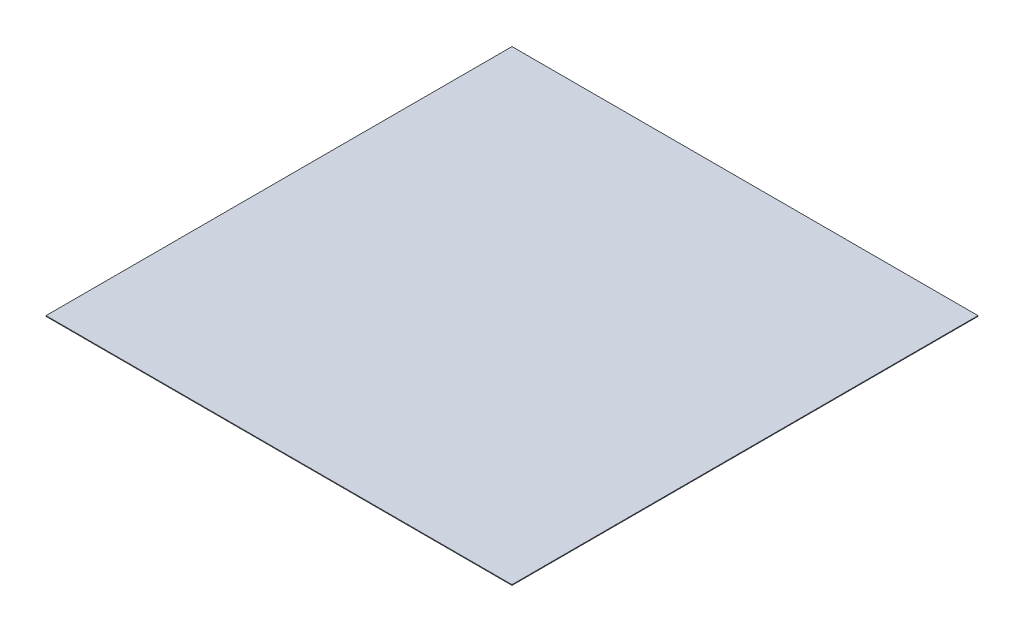
ISO-10303-21;
HEADER;
FILE_DESCRIPTION(('STEP AP214'),'2;1');
FILE_NAME('part.step','',(''),(''),'','','');
FILE_SCHEMA(('AUTOMOTIVE_DESIGN { 1 0 10303 214 1 1 1 1 }'));
ENDSEC;
DATA;
#1=APPLICATION_CONTEXT('core data for automotive mechanical design processes');
#2=APPLICATION_PROTOCOL_DEFINITION('international standard','automotive_design',2000,#1);
#3=PRODUCT_CONTEXT('',#1,'mechanical');
#4=PRODUCT('Part','Part','',(#3));
#5=PRODUCT_RELATED_PRODUCT_CATEGORY('part','',(#4));
#6=PRODUCT_DEFINITION_FORMATION('','',#4);
#7=PRODUCT_DEFINITION_CONTEXT('part definition',#1,'design');
#8=PRODUCT_DEFINITION('design','',#6,#7);
#9=PRODUCT_DEFINITION_SHAPE('','',#8);
#10=(LENGTH_UNIT() NAMED_UNIT(*) SI_UNIT(.MILLI.,.METRE.));
#11=(NAMED_UNIT(*) PLANE_ANGLE_UNIT() SI_UNIT($,.RADIAN.));
#12=(NAMED_UNIT(*) SI_UNIT($,.STERADIAN.) SOLID_ANGLE_UNIT());
#13=UNCERTAINTY_MEASURE_WITH_UNIT(LENGTH_MEASURE(1.E-05),#10,'distance_accuracy_value','');
#14=(GEOMETRIC_REPRESENTATION_CONTEXT(3) GLOBAL_UNCERTAINTY_ASSIGNED_CONTEXT((#13)) GLOBAL_UNIT_ASSIGNED_CONTEXT((#10,
#11,#12)) REPRESENTATION_CONTEXT('',''));
#15=CARTESIAN_POINT('',(0.,0.,0.));
#16=DIRECTION('',(0.,0.,1.));
#17=DIRECTION('',(1.,0.,0.));
#18=AXIS2_PLACEMENT_3D('',#15,#16,#17);
#19=CARTESIAN_POINT('',(-1700.,5.,1700.));
#20=DIRECTION('',(1.,0.,0.));
#21=DIRECTION('',(0.,0.,-1.));
#22=AXIS2_PLACEMENT_3D('',#19,#20,#21);
#23=PLANE('',#22);
#24=DIRECTION('',(0.,0.,1.));
#25=VECTOR('',#24,1.);
#26=CARTESIAN_POINT('',(-1700.,0.,1700.));
#27=LINE('',#26,#25);
#28=CARTESIAN_POINT('',(-1700.,0.,-1700.));
#29=VERTEX_POINT('',#28);
#30=CARTESIAN_POINT('',(-1700.,0.,1700.));
#31=VERTEX_POINT('',#30);
#32=EDGE_CURVE('E96',#29,#31,#27,.T.);
#33=ORIENTED_EDGE('',*,*,#32,.T.);
#34=DIRECTION('',(0.,-1.,0.));
#35=VECTOR('',#34,1.);
#36=CARTESIAN_POINT('',(-1700.,5.,1700.));
#37=LINE('',#36,#35);
#38=CARTESIAN_POINT('',(-1700.,5.,1700.));
#39=VERTEX_POINT('',#38);
#40=EDGE_CURVE('E11',#39,#31,#37,.T.);
#41=ORIENTED_EDGE('',*,*,#40,.F.);
#42=DIRECTION('',(0.,0.,1.));
#43=VECTOR('',#42,1.);
#44=CARTESIAN_POINT('',(-1700.,5.,1700.));
#45=LINE('',#44,#43);
#46=CARTESIAN_POINT('',(-1700.,5.,-1700.));
#47=VERTEX_POINT('',#46);
#48=EDGE_CURVE('E84',#47,#39,#45,.T.);
#49=ORIENTED_EDGE('',*,*,#48,.F.);
#50=DIRECTION('',(0.,-1.,0.));
#51=VECTOR('',#50,1.);
#52=CARTESIAN_POINT('',(-1700.,5.,-1700.));
#53=LINE('',#52,#51);
#54=EDGE_CURVE('E92',#47,#29,#53,.T.);
#55=ORIENTED_EDGE('',*,*,#54,.T.);
#56=EDGE_LOOP('',(#33,#41,#49,#55));
#57=FACE_BOUND('',#56,.T.);
#58=ADVANCED_FACE('F33',(#57),#23,.F.);
#59=CARTESIAN_POINT('',(1700.,5.,1700.));
#60=DIRECTION('',(0.,0.,-1.));
#61=DIRECTION('',(-1.,0.,0.));
#62=AXIS2_PLACEMENT_3D('',#59,#60,#61);
#63=PLANE('',#62);
#64=DIRECTION('',(1.,0.,0.));
#65=VECTOR('',#64,1.);
#66=CARTESIAN_POINT('',(1700.,0.,1700.));
#67=LINE('',#66,#65);
#68=CARTESIAN_POINT('',(1700.,0.,1700.));
#69=VERTEX_POINT('',#68);
#70=EDGE_CURVE('E88',#31,#69,#67,.T.);
#71=ORIENTED_EDGE('',*,*,#70,.T.);
#72=DIRECTION('',(0.,-1.,0.));
#73=VECTOR('',#72,1.);
#74=CARTESIAN_POINT('',(1700.,5.,1700.));
#75=LINE('',#74,#73);
#76=CARTESIAN_POINT('',(1700.,5.,1700.));
#77=VERTEX_POINT('',#76);
#78=EDGE_CURVE('E41',#77,#69,#75,.T.);
#79=ORIENTED_EDGE('',*,*,#78,.F.);
#80=DIRECTION('',(1.,0.,0.));
#81=VECTOR('',#80,1.);
#82=CARTESIAN_POINT('',(1700.,5.,1700.));
#83=LINE('',#82,#81);
#84=EDGE_CURVE('E79',#39,#77,#83,.T.);
#85=ORIENTED_EDGE('',*,*,#84,.F.);
#86=ORIENTED_EDGE('',*,*,#40,.T.);
#87=EDGE_LOOP('',(#71,#79,#85,#86));
#88=FACE_BOUND('',#87,.T.);
#89=ADVANCED_FACE('F87',(#88),#63,.F.);
#90=CARTESIAN_POINT('',(1700.,5.,1700.));
#91=DIRECTION('',(-1.,0.,0.));
#92=DIRECTION('',(0.,0.,1.));
#93=AXIS2_PLACEMENT_3D('',#90,#91,#92);
#94=PLANE('',#93);
#95=DIRECTION('',(0.,0.,-1.));
#96=VECTOR('',#95,1.);
#97=CARTESIAN_POINT('',(1700.,0.,1700.));
#98=LINE('',#97,#96);
#99=CARTESIAN_POINT('',(1700.,0.,-1700.));
#100=VERTEX_POINT('',#99);
#101=EDGE_CURVE('E66',#69,#100,#98,.T.);
#102=ORIENTED_EDGE('',*,*,#101,.T.);
#103=DIRECTION('',(0.,-1.,0.));
#104=VECTOR('',#103,1.);
#105=CARTESIAN_POINT('',(1700.,5.,-1700.));
#106=LINE('',#105,#104);
#107=CARTESIAN_POINT('',(1700.,5.,-1700.));
#108=VERTEX_POINT('',#107);
#109=EDGE_CURVE('E89',#108,#100,#106,.T.);
#110=ORIENTED_EDGE('',*,*,#109,.F.);
#111=DIRECTION('',(0.,0.,-1.));
#112=VECTOR('',#111,1.);
#113=CARTESIAN_POINT('',(1700.,5.,1700.));
#114=LINE('',#113,#112);
#115=EDGE_CURVE('E82',#77,#108,#114,.T.);
#116=ORIENTED_EDGE('',*,*,#115,.F.);
#117=ORIENTED_EDGE('',*,*,#78,.T.);
#118=EDGE_LOOP('',(#102,#110,#116,#117));
#119=FACE_BOUND('',#118,.T.);
#120=ADVANCED_FACE('F90',(#119),#94,.F.);
#121=CARTESIAN_POINT('',(1700.,5.,-1700.));
#122=DIRECTION('',(0.,0.,1.));
#123=DIRECTION('',(1.,0.,0.));
#124=AXIS2_PLACEMENT_3D('',#121,#122,#123);
#125=PLANE('',#124);
#126=DIRECTION('',(-1.,0.,0.));
#127=VECTOR('',#126,1.);
#128=CARTESIAN_POINT('',(1700.,0.,-1700.));
#129=LINE('',#128,#127);
#130=EDGE_CURVE('E72',#100,#29,#129,.T.);
#131=ORIENTED_EDGE('',*,*,#130,.T.);
#132=ORIENTED_EDGE('',*,*,#54,.F.);
#133=DIRECTION('',(-1.,0.,0.));
#134=VECTOR('',#133,1.);
#135=CARTESIAN_POINT('',(1700.,5.,-1700.));
#136=LINE('',#135,#134);
#137=EDGE_CURVE('E49',#108,#47,#136,.T.);
#138=ORIENTED_EDGE('',*,*,#137,.F.);
#139=ORIENTED_EDGE('',*,*,#109,.T.);
#140=EDGE_LOOP('',(#131,#132,#138,#139));
#141=FACE_BOUND('',#140,.T.);
#142=ADVANCED_FACE('F103',(#141),#125,.F.);
#143=CARTESIAN_POINT('',(0.,5.,0.));
#144=DIRECTION('',(0.,1.,0.));
#145=DIRECTION('',(0.,0.,1.));
#146=AXIS2_PLACEMENT_3D('',#143,#144,#145);
#147=PLANE('',#146);
#148=ORIENTED_EDGE('',*,*,#48,.T.);
#149=ORIENTED_EDGE('',*,*,#84,.T.);
#150=ORIENTED_EDGE('',*,*,#115,.T.);
#151=ORIENTED_EDGE('',*,*,#137,.T.);
#152=EDGE_LOOP('',(#148,#149,#150,#151));
#153=FACE_BOUND('',#152,.T.);
#154=ADVANCED_FACE('F80',(#153),#147,.T.);
#155=CARTESIAN_POINT('',(0.,0.,0.));
#156=DIRECTION('',(0.,1.,0.));
#157=DIRECTION('',(0.,0.,1.));
#158=AXIS2_PLACEMENT_3D('',#155,#156,#157);
#159=PLANE('',#158);
#160=ORIENTED_EDGE('',*,*,#32,.F.);
#161=ORIENTED_EDGE('',*,*,#130,.F.);
#162=ORIENTED_EDGE('',*,*,#101,.F.);
#163=ORIENTED_EDGE('',*,*,#70,.F.);
#164=EDGE_LOOP('',(#160,#161,#162,#163));
#165=FACE_BOUND('',#164,.T.);
#166=ADVANCED_FACE('F106',(#165),#159,.F.);
#167=CLOSED_SHELL('',(#58,#89,#120,#142,#154,#166));
#168=MANIFOLD_SOLID_BREP('B2',#167);
#169=ADVANCED_BREP_SHAPE_REPRESENTATION('',(#18,#168),#14);
#170=SHAPE_DEFINITION_REPRESENTATION(#9,#169);
ENDSEC;
END-ISO-10303-21;
